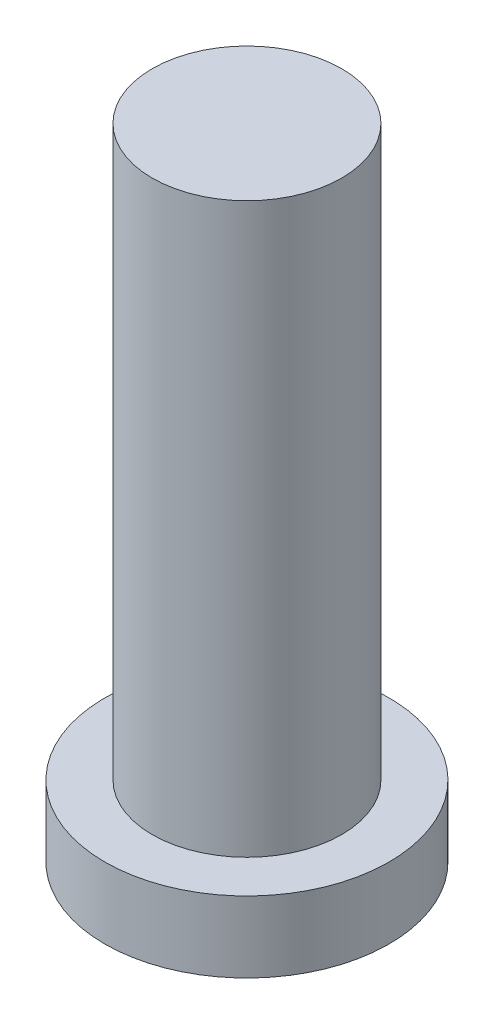
ISO-10303-21;
HEADER;
FILE_DESCRIPTION(('STEP AP214'),'2;1');
FILE_NAME('part.step','',(''),(''),'','','');
FILE_SCHEMA(('AUTOMOTIVE_DESIGN { 1 0 10303 214 1 1 1 1 }'));
ENDSEC;
DATA;
#1=APPLICATION_CONTEXT('core data for automotive mechanical design processes');
#2=APPLICATION_PROTOCOL_DEFINITION('international standard','automotive_design',2000,#1);
#3=PRODUCT_CONTEXT('',#1,'mechanical');
#4=PRODUCT('Part','Part','',(#3));
#5=PRODUCT_RELATED_PRODUCT_CATEGORY('part','',(#4));
#6=PRODUCT_DEFINITION_FORMATION('','',#4);
#7=PRODUCT_DEFINITION_CONTEXT('part definition',#1,'design');
#8=PRODUCT_DEFINITION('design','',#6,#7);
#9=PRODUCT_DEFINITION_SHAPE('','',#8);
#10=(LENGTH_UNIT() NAMED_UNIT(*) SI_UNIT(.MILLI.,.METRE.));
#11=(NAMED_UNIT(*) PLANE_ANGLE_UNIT() SI_UNIT($,.RADIAN.));
#12=(NAMED_UNIT(*) SI_UNIT($,.STERADIAN.) SOLID_ANGLE_UNIT());
#13=UNCERTAINTY_MEASURE_WITH_UNIT(LENGTH_MEASURE(1.E-05),#10,'distance_accuracy_value','');
#14=(GEOMETRIC_REPRESENTATION_CONTEXT(3) GLOBAL_UNCERTAINTY_ASSIGNED_CONTEXT((#13)) GLOBAL_UNIT_ASSIGNED_CONTEXT((#10,
#11,#12)) REPRESENTATION_CONTEXT('',''));
#15=CARTESIAN_POINT('',(0.,0.,0.));
#16=DIRECTION('',(0.,0.,1.));
#17=DIRECTION('',(1.,0.,0.));
#18=AXIS2_PLACEMENT_3D('',#15,#16,#17);
#19=CARTESIAN_POINT('',(0.,1.5,0.));
#20=DIRECTION('',(0.,-1.,0.));
#21=DIRECTION('',(0.,0.,-1.));
#22=AXIS2_PLACEMENT_3D('',#19,#20,#21);
#23=CYLINDRICAL_SURFACE('',#22,3.);
#24=CARTESIAN_POINT('',(0.,1.5,0.));
#25=DIRECTION('',(0.,1.,0.));
#26=DIRECTION('',(0.,0.,1.));
#27=AXIS2_PLACEMENT_3D('',#24,#25,#26);
#28=CIRCLE('',#27,3.);
#29=CARTESIAN_POINT('',(0.,1.5,3.));
#30=VERTEX_POINT('',#29);
#31=EDGE_CURVE('E49',#30,#30,#28,.T.);
#32=ORIENTED_EDGE('',*,*,#31,.F.);
#33=EDGE_LOOP('',(#32));
#34=FACE_BOUND('',#33,.T.);
#35=CARTESIAN_POINT('',(0.,0.,0.));
#36=DIRECTION('',(0.,1.,0.));
#37=DIRECTION('',(0.,0.,1.));
#38=AXIS2_PLACEMENT_3D('',#35,#36,#37);
#39=CIRCLE('',#38,3.);
#40=CARTESIAN_POINT('',(0.,0.,3.));
#41=VERTEX_POINT('',#40);
#42=EDGE_CURVE('E44',#41,#41,#39,.T.);
#43=ORIENTED_EDGE('',*,*,#42,.T.);
#44=EDGE_LOOP('',(#43));
#45=FACE_BOUND('',#44,.T.);
#46=ADVANCED_FACE('F41',(#34,#45),#23,.T.);
#47=CARTESIAN_POINT('',(0.,1.5,0.));
#48=DIRECTION('',(0.,1.,0.));
#49=DIRECTION('',(0.,0.,1.));
#50=AXIS2_PLACEMENT_3D('',#47,#48,#49);
#51=PLANE('',#50);
#52=CARTESIAN_POINT('',(0.,1.5,0.));
#53=DIRECTION('',(0.,1.,0.));
#54=DIRECTION('',(0.,0.,1.));
#55=AXIS2_PLACEMENT_3D('',#52,#53,#54);
#56=CIRCLE('',#55,2.);
#57=CARTESIAN_POINT('',(0.,1.5,2.));
#58=VERTEX_POINT('',#57);
#59=EDGE_CURVE('E10',#58,#58,#56,.T.);
#60=ORIENTED_EDGE('',*,*,#59,.F.);
#61=EDGE_LOOP('',(#60));
#62=FACE_BOUND('',#61,.T.);
#63=ORIENTED_EDGE('',*,*,#31,.T.);
#64=EDGE_LOOP('',(#63));
#65=FACE_BOUND('',#64,.T.);
#66=ADVANCED_FACE('F69',(#62,#65),#51,.T.);
#67=CARTESIAN_POINT('',(0.,0.,0.));
#68=DIRECTION('',(0.,1.,0.));
#69=DIRECTION('',(0.,0.,1.));
#70=AXIS2_PLACEMENT_3D('',#67,#68,#69);
#71=PLANE('',#70);
#72=ORIENTED_EDGE('',*,*,#42,.F.);
#73=EDGE_LOOP('',(#72));
#74=FACE_BOUND('',#73,.T.);
#75=ADVANCED_FACE('F66',(#74),#71,.F.);
#76=CARTESIAN_POINT('',(0.,13.5,0.));
#77=DIRECTION('',(0.,-1.,0.));
#78=DIRECTION('',(0.,0.,-1.));
#79=AXIS2_PLACEMENT_3D('',#76,#77,#78);
#80=CYLINDRICAL_SURFACE('',#79,2.);
#81=CARTESIAN_POINT('',(0.,13.5,0.));
#82=DIRECTION('',(0.,1.,0.));
#83=DIRECTION('',(0.,0.,1.));
#84=AXIS2_PLACEMENT_3D('',#81,#82,#83);
#85=CIRCLE('',#84,2.);
#86=CARTESIAN_POINT('',(0.,13.5,2.));
#87=VERTEX_POINT('',#86);
#88=EDGE_CURVE('E56',#87,#87,#85,.T.);
#89=ORIENTED_EDGE('',*,*,#88,.F.);
#90=EDGE_LOOP('',(#89));
#91=FACE_BOUND('',#90,.T.);
#92=ORIENTED_EDGE('',*,*,#59,.T.);
#93=EDGE_LOOP('',(#92));
#94=FACE_BOUND('',#93,.T.);
#95=ADVANCED_FACE('F68',(#91,#94),#80,.T.);
#96=CARTESIAN_POINT('',(0.,13.5,0.));
#97=DIRECTION('',(0.,1.,0.));
#98=DIRECTION('',(0.,0.,1.));
#99=AXIS2_PLACEMENT_3D('',#96,#97,#98);
#100=PLANE('',#99);
#101=ORIENTED_EDGE('',*,*,#88,.T.);
#102=EDGE_LOOP('',(#101));
#103=FACE_BOUND('',#102,.T.);
#104=ADVANCED_FACE('F74',(#103),#100,.T.);
#105=CLOSED_SHELL('',(#46,#66,#75,#95,#104));
#106=MANIFOLD_SOLID_BREP('B2',#105);
#107=ADVANCED_BREP_SHAPE_REPRESENTATION('',(#18,#106),#14);
#108=SHAPE_DEFINITION_REPRESENTATION(#9,#107);
ENDSEC;
END-ISO-10303-21;
